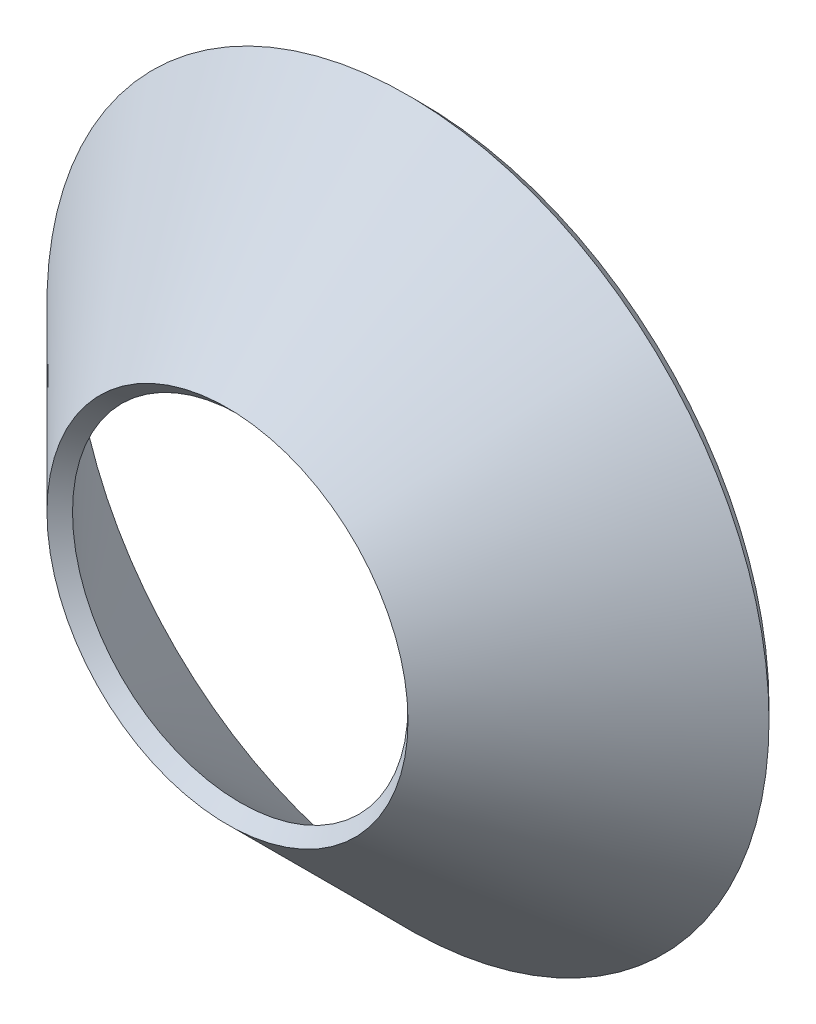
ISO-10303-21;
HEADER;
FILE_DESCRIPTION(('STEP AP214'),'2;1');
FILE_NAME('part.step','',(''),(''),'','','');
FILE_SCHEMA(('AUTOMOTIVE_DESIGN { 1 0 10303 214 1 1 1 1 }'));
ENDSEC;
DATA;
#1=APPLICATION_CONTEXT('core data for automotive mechanical design processes');
#2=APPLICATION_PROTOCOL_DEFINITION('international standard','automotive_design',2000,#1);
#3=PRODUCT_CONTEXT('',#1,'mechanical');
#4=PRODUCT('Part','Part','',(#3));
#5=PRODUCT_RELATED_PRODUCT_CATEGORY('part','',(#4));
#6=PRODUCT_DEFINITION_FORMATION('','',#4);
#7=PRODUCT_DEFINITION_CONTEXT('part definition',#1,'design');
#8=PRODUCT_DEFINITION('design','',#6,#7);
#9=PRODUCT_DEFINITION_SHAPE('','',#8);
#10=(LENGTH_UNIT() NAMED_UNIT(*) SI_UNIT(.MILLI.,.METRE.));
#11=(NAMED_UNIT(*) PLANE_ANGLE_UNIT() SI_UNIT($,.RADIAN.));
#12=(NAMED_UNIT(*) SI_UNIT($,.STERADIAN.) SOLID_ANGLE_UNIT());
#13=UNCERTAINTY_MEASURE_WITH_UNIT(LENGTH_MEASURE(1.E-05),#10,'distance_accuracy_value','');
#14=(GEOMETRIC_REPRESENTATION_CONTEXT(3) GLOBAL_UNCERTAINTY_ASSIGNED_CONTEXT((#13)) GLOBAL_UNIT_ASSIGNED_CONTEXT((#10,
#11,#12)) REPRESENTATION_CONTEXT('',''));
#15=CARTESIAN_POINT('',(0.,0.,0.));
#16=DIRECTION('',(0.,0.,1.));
#17=DIRECTION('',(1.,0.,0.));
#18=AXIS2_PLACEMENT_3D('',#15,#16,#17);
#19=CARTESIAN_POINT('',(0.,0.,23.6039487757862));
#20=DIRECTION('',(0.,0.,-1.));
#21=DIRECTION('',(-1.,0.,0.));
#22=AXIS2_PLACEMENT_3D('',#19,#20,#21);
#23=CONICAL_SURFACE('',#22,23.6039487757862,0.785398163397454);
#24=CARTESIAN_POINT('',(0.,0.,-1.79605122421385));
#25=DIRECTION('',(0.,0.,1.));
#26=DIRECTION('',(1.,0.,0.));
#27=AXIS2_PLACEMENT_3D('',#24,#25,#26);
#28=CIRCLE('',#27,49.0039487757865);
#29=CARTESIAN_POINT('',(49.0039487757865,0.,-1.79605122421385));
#30=VERTEX_POINT('',#29);
#31=EDGE_CURVE('E60',#30,#30,#28,.T.);
#32=ORIENTED_EDGE('',*,*,#31,.F.);
#33=EDGE_LOOP('',(#32));
#34=FACE_BOUND('',#33,.T.);
#35=CARTESIAN_POINT('',(0.,0.,23.6039487757862));
#36=DIRECTION('',(0.,0.,1.));
#37=DIRECTION('',(1.,0.,0.));
#38=AXIS2_PLACEMENT_3D('',#35,#36,#37);
#39=CIRCLE('',#38,23.6039487757862);
#40=CARTESIAN_POINT('',(23.6039487757862,0.,23.6039487757862));
#41=VERTEX_POINT('',#40);
#42=EDGE_CURVE('E10',#41,#41,#39,.T.);
#43=ORIENTED_EDGE('',*,*,#42,.T.);
#44=EDGE_LOOP('',(#43));
#45=FACE_BOUND('',#44,.T.);
#46=ADVANCED_FACE('F43',(#34,#45),#23,.F.);
#47=CARTESIAN_POINT('',(0.,0.,23.6039487757862));
#48=DIRECTION('',(0.,0.,1.));
#49=DIRECTION('',(1.,0.,0.));
#50=AXIS2_PLACEMENT_3D('',#47,#48,#49);
#51=CONICAL_SURFACE('',#50,23.6039487757862,0.785398163397443);
#52=CARTESIAN_POINT('',(0.,0.,25.4));
#53=DIRECTION('',(0.,0.,1.));
#54=DIRECTION('',(1.,0.,0.));
#55=AXIS2_PLACEMENT_3D('',#52,#53,#54);
#56=CIRCLE('',#55,25.4);
#57=CARTESIAN_POINT('',(25.4,0.,25.4));
#58=VERTEX_POINT('',#57);
#59=EDGE_CURVE('E50',#58,#58,#56,.T.);
#60=ORIENTED_EDGE('',*,*,#59,.T.);
#61=EDGE_LOOP('',(#60));
#62=FACE_BOUND('',#61,.T.);
#63=ORIENTED_EDGE('',*,*,#42,.F.);
#64=EDGE_LOOP('',(#63));
#65=FACE_BOUND('',#64,.T.);
#66=ADVANCED_FACE('F71',(#62,#65),#51,.F.);
#67=CARTESIAN_POINT('',(0.,0.,25.4));
#68=DIRECTION('',(0.,0.,-1.));
#69=DIRECTION('',(-1.,0.,0.));
#70=AXIS2_PLACEMENT_3D('',#67,#68,#69);
#71=CONICAL_SURFACE('',#70,25.4,0.785398163397454);
#72=CARTESIAN_POINT('',(0.,0.,0.));
#73=DIRECTION('',(0.,0.,1.));
#74=DIRECTION('',(1.,0.,0.));
#75=AXIS2_PLACEMENT_3D('',#72,#73,#74);
#76=CIRCLE('',#75,50.8000000000003);
#77=CARTESIAN_POINT('',(50.8000000000003,0.,0.));
#78=VERTEX_POINT('',#77);
#79=EDGE_CURVE('E55',#78,#78,#76,.T.);
#80=ORIENTED_EDGE('',*,*,#79,.T.);
#81=EDGE_LOOP('',(#80));
#82=FACE_BOUND('',#81,.T.);
#83=ORIENTED_EDGE('',*,*,#59,.F.);
#84=EDGE_LOOP('',(#83));
#85=FACE_BOUND('',#84,.T.);
#86=ADVANCED_FACE('F75',(#82,#85),#71,.T.);
#87=CARTESIAN_POINT('',(0.,0.,0.));
#88=DIRECTION('',(0.,0.,1.));
#89=DIRECTION('',(1.,0.,0.));
#90=AXIS2_PLACEMENT_3D('',#87,#88,#89);
#91=CONICAL_SURFACE('',#90,50.8000000000003,0.78539816339744);
#92=ORIENTED_EDGE('',*,*,#31,.T.);
#93=EDGE_LOOP('',(#92));
#94=FACE_BOUND('',#93,.T.);
#95=ORIENTED_EDGE('',*,*,#79,.F.);
#96=EDGE_LOOP('',(#95));
#97=FACE_BOUND('',#96,.T.);
#98=ADVANCED_FACE('F67',(#94,#97),#91,.T.);
#99=CLOSED_SHELL('',(#46,#66,#86,#98));
#100=MANIFOLD_SOLID_BREP('B2',#99);
#101=ADVANCED_BREP_SHAPE_REPRESENTATION('',(#18,#100),#14);
#102=SHAPE_DEFINITION_REPRESENTATION(#9,#101);
ENDSEC;
END-ISO-10303-21;
